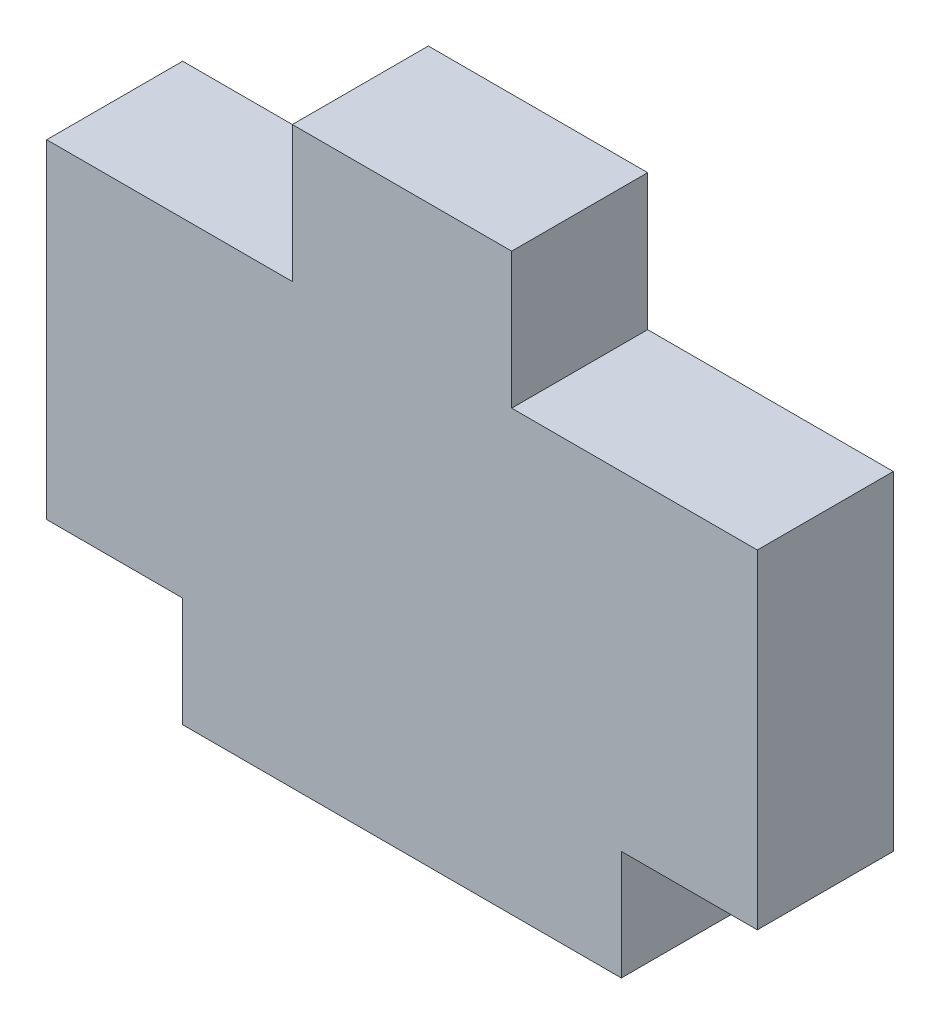
ISO-10303-21;
HEADER;
FILE_DESCRIPTION(('STEP AP214'),'2;1');
FILE_NAME('part.step','',(''),(''),'','','');
FILE_SCHEMA(('AUTOMOTIVE_DESIGN { 1 0 10303 214 1 1 1 1 }'));
ENDSEC;
DATA;
#1=APPLICATION_CONTEXT('core data for automotive mechanical design processes');
#2=APPLICATION_PROTOCOL_DEFINITION('international standard','automotive_design',2000,#1);
#3=PRODUCT_CONTEXT('',#1,'mechanical');
#4=PRODUCT('Part','Part','',(#3));
#5=PRODUCT_RELATED_PRODUCT_CATEGORY('part','',(#4));
#6=PRODUCT_DEFINITION_FORMATION('','',#4);
#7=PRODUCT_DEFINITION_CONTEXT('part definition',#1,'design');
#8=PRODUCT_DEFINITION('design','',#6,#7);
#9=PRODUCT_DEFINITION_SHAPE('','',#8);
#10=(LENGTH_UNIT() NAMED_UNIT(*) SI_UNIT(.MILLI.,.METRE.));
#11=(NAMED_UNIT(*) PLANE_ANGLE_UNIT() SI_UNIT($,.RADIAN.));
#12=(NAMED_UNIT(*) SI_UNIT($,.STERADIAN.) SOLID_ANGLE_UNIT());
#13=UNCERTAINTY_MEASURE_WITH_UNIT(LENGTH_MEASURE(1.E-05),#10,'distance_accuracy_value','');
#14=(GEOMETRIC_REPRESENTATION_CONTEXT(3) GLOBAL_UNCERTAINTY_ASSIGNED_CONTEXT((#13)) GLOBAL_UNIT_ASSIGNED_CONTEXT((#10,
#11,#12)) REPRESENTATION_CONTEXT('',''));
#15=CARTESIAN_POINT('',(0.,0.,0.));
#16=DIRECTION('',(0.,0.,1.));
#17=DIRECTION('',(1.,0.,0.));
#18=AXIS2_PLACEMENT_3D('',#15,#16,#17);
#19=CARTESIAN_POINT('',(32.4,10.,12.4));
#20=DIRECTION('',(-1.,0.,0.));
#21=DIRECTION('',(0.,0.,1.));
#22=AXIS2_PLACEMENT_3D('',#19,#20,#21);
#23=PLANE('',#22);
#24=DIRECTION('',(0.,1.,0.));
#25=VECTOR('',#24,1.);
#26=CARTESIAN_POINT('',(32.4,10.,0.));
#27=LINE('',#26,#25);
#28=CARTESIAN_POINT('',(32.4,10.,0.));
#29=VERTEX_POINT('',#28);
#30=CARTESIAN_POINT('',(32.4,40.,0.));
#31=VERTEX_POINT('',#30);
#32=EDGE_CURVE('E153',#29,#31,#27,.T.);
#33=ORIENTED_EDGE('',*,*,#32,.T.);
#34=DIRECTION('',(0.,0.,-1.));
#35=VECTOR('',#34,1.);
#36=CARTESIAN_POINT('',(32.4,40.,12.4));
#37=LINE('',#36,#35);
#38=CARTESIAN_POINT('',(32.4,40.,12.4));
#39=VERTEX_POINT('',#38);
#40=EDGE_CURVE('E11',#39,#31,#37,.T.);
#41=ORIENTED_EDGE('',*,*,#40,.F.);
#42=DIRECTION('',(0.,1.,0.));
#43=VECTOR('',#42,1.);
#44=CARTESIAN_POINT('',(32.4,10.,12.4));
#45=LINE('',#44,#43);
#46=CARTESIAN_POINT('',(32.4,10.,12.4));
#47=VERTEX_POINT('',#46);
#48=EDGE_CURVE('E175',#47,#39,#45,.T.);
#49=ORIENTED_EDGE('',*,*,#48,.F.);
#50=DIRECTION('',(0.,0.,-1.));
#51=VECTOR('',#50,1.);
#52=CARTESIAN_POINT('',(32.4,10.,12.4));
#53=LINE('',#52,#51);
#54=EDGE_CURVE('E149',#47,#29,#53,.T.);
#55=ORIENTED_EDGE('',*,*,#54,.T.);
#56=EDGE_LOOP('',(#33,#41,#49,#55));
#57=FACE_BOUND('',#56,.T.);
#58=ADVANCED_FACE('F33',(#57),#23,.F.);
#59=CARTESIAN_POINT('',(10.,40.,12.4));
#60=DIRECTION('',(0.,-1.,0.));
#61=DIRECTION('',(0.,0.,-1.));
#62=AXIS2_PLACEMENT_3D('',#59,#60,#61);
#63=PLANE('',#62);
#64=DIRECTION('',(-1.,0.,0.));
#65=VECTOR('',#64,1.);
#66=CARTESIAN_POINT('',(10.,40.,0.));
#67=LINE('',#66,#65);
#68=CARTESIAN_POINT('',(10.,40.,0.));
#69=VERTEX_POINT('',#68);
#70=EDGE_CURVE('E156',#31,#69,#67,.T.);
#71=ORIENTED_EDGE('',*,*,#70,.T.);
#72=DIRECTION('',(0.,0.,-1.));
#73=VECTOR('',#72,1.);
#74=CARTESIAN_POINT('',(10.,40.,12.4));
#75=LINE('',#74,#73);
#76=CARTESIAN_POINT('',(10.,40.,12.4));
#77=VERTEX_POINT('',#76);
#78=EDGE_CURVE('E41',#77,#69,#75,.T.);
#79=ORIENTED_EDGE('',*,*,#78,.F.);
#80=DIRECTION('',(-1.,0.,0.));
#81=VECTOR('',#80,1.);
#82=CARTESIAN_POINT('',(10.,40.,12.4));
#83=LINE('',#82,#81);
#84=EDGE_CURVE('E104',#39,#77,#83,.T.);
#85=ORIENTED_EDGE('',*,*,#84,.F.);
#86=ORIENTED_EDGE('',*,*,#40,.T.);
#87=EDGE_LOOP('',(#71,#79,#85,#86));
#88=FACE_BOUND('',#87,.T.);
#89=ADVANCED_FACE('F253',(#88),#63,.F.);
#90=CARTESIAN_POINT('',(10.,40.,12.4));
#91=DIRECTION('',(-1.,0.,0.));
#92=DIRECTION('',(0.,0.,1.));
#93=AXIS2_PLACEMENT_3D('',#90,#91,#92);
#94=PLANE('',#93);
#95=DIRECTION('',(0.,1.,0.));
#96=VECTOR('',#95,1.);
#97=CARTESIAN_POINT('',(10.,40.,0.));
#98=LINE('',#97,#96);
#99=CARTESIAN_POINT('',(10.,52.4,0.));
#100=VERTEX_POINT('',#99);
#101=EDGE_CURVE('E158',#69,#100,#98,.T.);
#102=ORIENTED_EDGE('',*,*,#101,.T.);
#103=DIRECTION('',(0.,0.,-1.));
#104=VECTOR('',#103,1.);
#105=CARTESIAN_POINT('',(10.,52.4,12.4));
#106=LINE('',#105,#104);
#107=CARTESIAN_POINT('',(10.,52.4,12.4));
#108=VERTEX_POINT('',#107);
#109=EDGE_CURVE('E194',#108,#100,#106,.T.);
#110=ORIENTED_EDGE('',*,*,#109,.F.);
#111=DIRECTION('',(0.,1.,0.));
#112=VECTOR('',#111,1.);
#113=CARTESIAN_POINT('',(10.,40.,12.4));
#114=LINE('',#113,#112);
#115=EDGE_CURVE('E202',#77,#108,#114,.T.);
#116=ORIENTED_EDGE('',*,*,#115,.F.);
#117=ORIENTED_EDGE('',*,*,#78,.T.);
#118=EDGE_LOOP('',(#102,#110,#116,#117));
#119=FACE_BOUND('',#118,.T.);
#120=ADVANCED_FACE('F200',(#119),#94,.F.);
#121=CARTESIAN_POINT('',(-10.,52.4,12.4));
#122=DIRECTION('',(0.,-1.,0.));
#123=DIRECTION('',(0.,0.,-1.));
#124=AXIS2_PLACEMENT_3D('',#121,#122,#123);
#125=PLANE('',#124);
#126=DIRECTION('',(-1.,0.,0.));
#127=VECTOR('',#126,1.);
#128=CARTESIAN_POINT('',(-10.,52.4,0.));
#129=LINE('',#128,#127);
#130=CARTESIAN_POINT('',(-10.,52.4,0.));
#131=VERTEX_POINT('',#130);
#132=EDGE_CURVE('E160',#100,#131,#129,.T.);
#133=ORIENTED_EDGE('',*,*,#132,.T.);
#134=DIRECTION('',(0.,0.,-1.));
#135=VECTOR('',#134,1.);
#136=CARTESIAN_POINT('',(-10.,52.4,12.4));
#137=LINE('',#136,#135);
#138=CARTESIAN_POINT('',(-10.,52.4,12.4));
#139=VERTEX_POINT('',#138);
#140=EDGE_CURVE('E191',#139,#131,#137,.T.);
#141=ORIENTED_EDGE('',*,*,#140,.F.);
#142=DIRECTION('',(-1.,0.,0.));
#143=VECTOR('',#142,1.);
#144=CARTESIAN_POINT('',(-10.,52.4,12.4));
#145=LINE('',#144,#143);
#146=EDGE_CURVE('E220',#108,#139,#145,.T.);
#147=ORIENTED_EDGE('',*,*,#146,.F.);
#148=ORIENTED_EDGE('',*,*,#109,.T.);
#149=EDGE_LOOP('',(#133,#141,#147,#148));
#150=FACE_BOUND('',#149,.T.);
#151=ADVANCED_FACE('F211',(#150),#125,.F.);
#152=CARTESIAN_POINT('',(-10.,40.,12.4));
#153=DIRECTION('',(1.,0.,0.));
#154=DIRECTION('',(0.,0.,-1.));
#155=AXIS2_PLACEMENT_3D('',#152,#153,#154);
#156=PLANE('',#155);
#157=DIRECTION('',(0.,-1.,0.));
#158=VECTOR('',#157,1.);
#159=CARTESIAN_POINT('',(-10.,40.,0.));
#160=LINE('',#159,#158);
#161=CARTESIAN_POINT('',(-10.,40.,0.));
#162=VERTEX_POINT('',#161);
#163=EDGE_CURVE('E162',#131,#162,#160,.T.);
#164=ORIENTED_EDGE('',*,*,#163,.T.);
#165=DIRECTION('',(0.,0.,-1.));
#166=VECTOR('',#165,1.);
#167=CARTESIAN_POINT('',(-10.,40.,12.4));
#168=LINE('',#167,#166);
#169=CARTESIAN_POINT('',(-10.,40.,12.4));
#170=VERTEX_POINT('',#169);
#171=EDGE_CURVE('E188',#170,#162,#168,.T.);
#172=ORIENTED_EDGE('',*,*,#171,.F.);
#173=DIRECTION('',(0.,-1.,0.));
#174=VECTOR('',#173,1.);
#175=CARTESIAN_POINT('',(-10.,40.,12.4));
#176=LINE('',#175,#174);
#177=EDGE_CURVE('E217',#139,#170,#176,.T.);
#178=ORIENTED_EDGE('',*,*,#177,.F.);
#179=ORIENTED_EDGE('',*,*,#140,.T.);
#180=EDGE_LOOP('',(#164,#172,#178,#179));
#181=FACE_BOUND('',#180,.T.);
#182=ADVANCED_FACE('F215',(#181),#156,.F.);
#183=CARTESIAN_POINT('',(-32.4,40.,12.4));
#184=DIRECTION('',(0.,-1.,0.));
#185=DIRECTION('',(0.,0.,-1.));
#186=AXIS2_PLACEMENT_3D('',#183,#184,#185);
#187=PLANE('',#186);
#188=DIRECTION('',(-1.,0.,0.));
#189=VECTOR('',#188,1.);
#190=CARTESIAN_POINT('',(-32.4,40.,0.));
#191=LINE('',#190,#189);
#192=CARTESIAN_POINT('',(-32.4,40.,0.));
#193=VERTEX_POINT('',#192);
#194=EDGE_CURVE('E164',#162,#193,#191,.T.);
#195=ORIENTED_EDGE('',*,*,#194,.T.);
#196=DIRECTION('',(0.,0.,-1.));
#197=VECTOR('',#196,1.);
#198=CARTESIAN_POINT('',(-32.4,40.,12.4));
#199=LINE('',#198,#197);
#200=CARTESIAN_POINT('',(-32.4,40.,12.4));
#201=VERTEX_POINT('',#200);
#202=EDGE_CURVE('E185',#201,#193,#199,.T.);
#203=ORIENTED_EDGE('',*,*,#202,.F.);
#204=DIRECTION('',(-1.,0.,0.));
#205=VECTOR('',#204,1.);
#206=CARTESIAN_POINT('',(-32.4,40.,12.4));
#207=LINE('',#206,#205);
#208=EDGE_CURVE('E219',#170,#201,#207,.T.);
#209=ORIENTED_EDGE('',*,*,#208,.F.);
#210=ORIENTED_EDGE('',*,*,#171,.T.);
#211=EDGE_LOOP('',(#195,#203,#209,#210));
#212=FACE_BOUND('',#211,.T.);
#213=ADVANCED_FACE('F266',(#212),#187,.F.);
#214=CARTESIAN_POINT('',(-32.4,10.,12.4));
#215=DIRECTION('',(1.,0.,0.));
#216=DIRECTION('',(0.,0.,-1.));
#217=AXIS2_PLACEMENT_3D('',#214,#215,#216);
#218=PLANE('',#217);
#219=DIRECTION('',(0.,-1.,0.));
#220=VECTOR('',#219,1.);
#221=CARTESIAN_POINT('',(-32.4,10.,0.));
#222=LINE('',#221,#220);
#223=CARTESIAN_POINT('',(-32.4,10.,0.));
#224=VERTEX_POINT('',#223);
#225=EDGE_CURVE('E166',#193,#224,#222,.T.);
#226=ORIENTED_EDGE('',*,*,#225,.T.);
#227=DIRECTION('',(0.,0.,-1.));
#228=VECTOR('',#227,1.);
#229=CARTESIAN_POINT('',(-32.4,10.,12.4));
#230=LINE('',#229,#228);
#231=CARTESIAN_POINT('',(-32.4,10.,12.4));
#232=VERTEX_POINT('',#231);
#233=EDGE_CURVE('E182',#232,#224,#230,.T.);
#234=ORIENTED_EDGE('',*,*,#233,.F.);
#235=DIRECTION('',(0.,-1.,0.));
#236=VECTOR('',#235,1.);
#237=CARTESIAN_POINT('',(-32.4,10.,12.4));
#238=LINE('',#237,#236);
#239=EDGE_CURVE('E222',#201,#232,#238,.T.);
#240=ORIENTED_EDGE('',*,*,#239,.F.);
#241=ORIENTED_EDGE('',*,*,#202,.T.);
#242=EDGE_LOOP('',(#226,#234,#240,#241));
#243=FACE_BOUND('',#242,.T.);
#244=ADVANCED_FACE('F269',(#243),#218,.F.);
#245=CARTESIAN_POINT('',(-32.4,10.,12.4));
#246=DIRECTION('',(0.,1.,0.));
#247=DIRECTION('',(0.,0.,1.));
#248=AXIS2_PLACEMENT_3D('',#245,#246,#247);
#249=PLANE('',#248);
#250=DIRECTION('',(1.,0.,0.));
#251=VECTOR('',#250,1.);
#252=CARTESIAN_POINT('',(-32.4,10.,0.));
#253=LINE('',#252,#251);
#254=CARTESIAN_POINT('',(-20.,10.,0.));
#255=VERTEX_POINT('',#254);
#256=EDGE_CURVE('E168',#224,#255,#253,.T.);
#257=ORIENTED_EDGE('',*,*,#256,.T.);
#258=DIRECTION('',(0.,0.,-1.));
#259=VECTOR('',#258,1.);
#260=CARTESIAN_POINT('',(-20.,10.,12.4));
#261=LINE('',#260,#259);
#262=CARTESIAN_POINT('',(-20.,10.,12.4));
#263=VERTEX_POINT('',#262);
#264=EDGE_CURVE('E179',#263,#255,#261,.T.);
#265=ORIENTED_EDGE('',*,*,#264,.F.);
#266=DIRECTION('',(1.,0.,0.));
#267=VECTOR('',#266,1.);
#268=CARTESIAN_POINT('',(-32.4,10.,12.4));
#269=LINE('',#268,#267);
#270=EDGE_CURVE('E228',#232,#263,#269,.T.);
#271=ORIENTED_EDGE('',*,*,#270,.F.);
#272=ORIENTED_EDGE('',*,*,#233,.T.);
#273=EDGE_LOOP('',(#257,#265,#271,#272));
#274=FACE_BOUND('',#273,.T.);
#275=ADVANCED_FACE('F234',(#274),#249,.F.);
#276=CARTESIAN_POINT('',(-20.,10.,12.4));
#277=DIRECTION('',(1.,0.,0.));
#278=DIRECTION('',(0.,0.,-1.));
#279=AXIS2_PLACEMENT_3D('',#276,#277,#278);
#280=PLANE('',#279);
#281=DIRECTION('',(0.,-1.,0.));
#282=VECTOR('',#281,1.);
#283=CARTESIAN_POINT('',(-20.,10.,0.));
#284=LINE('',#283,#282);
#285=CARTESIAN_POINT('',(-20.,0.,0.));
#286=VERTEX_POINT('',#285);
#287=EDGE_CURVE('E170',#255,#286,#284,.T.);
#288=ORIENTED_EDGE('',*,*,#287,.T.);
#289=DIRECTION('',(0.,0.,-1.));
#290=VECTOR('',#289,1.);
#291=CARTESIAN_POINT('',(-20.,0.,12.4));
#292=LINE('',#291,#290);
#293=CARTESIAN_POINT('',(-20.,0.,12.4));
#294=VERTEX_POINT('',#293);
#295=EDGE_CURVE('E144',#294,#286,#292,.T.);
#296=ORIENTED_EDGE('',*,*,#295,.F.);
#297=DIRECTION('',(0.,-1.,0.));
#298=VECTOR('',#297,1.);
#299=CARTESIAN_POINT('',(-20.,10.,12.4));
#300=LINE('',#299,#298);
#301=EDGE_CURVE('E135',#263,#294,#300,.T.);
#302=ORIENTED_EDGE('',*,*,#301,.F.);
#303=ORIENTED_EDGE('',*,*,#264,.T.);
#304=EDGE_LOOP('',(#288,#296,#302,#303));
#305=FACE_BOUND('',#304,.T.);
#306=ADVANCED_FACE('F238',(#305),#280,.F.);
#307=CARTESIAN_POINT('',(-20.,0.,12.4));
#308=DIRECTION('',(0.,1.,0.));
#309=DIRECTION('',(0.,0.,1.));
#310=AXIS2_PLACEMENT_3D('',#307,#308,#309);
#311=PLANE('',#310);
#312=DIRECTION('',(1.,0.,0.));
#313=VECTOR('',#312,1.);
#314=CARTESIAN_POINT('',(-20.,0.,0.));
#315=LINE('',#314,#313);
#316=CARTESIAN_POINT('',(20.,0.,0.));
#317=VERTEX_POINT('',#316);
#318=EDGE_CURVE('E143',#286,#317,#315,.T.);
#319=ORIENTED_EDGE('',*,*,#318,.T.);
#320=DIRECTION('',(0.,0.,-1.));
#321=VECTOR('',#320,1.);
#322=CARTESIAN_POINT('',(20.,0.,12.4));
#323=LINE('',#322,#321);
#324=CARTESIAN_POINT('',(20.,0.,12.4));
#325=VERTEX_POINT('',#324);
#326=EDGE_CURVE('E140',#325,#317,#323,.T.);
#327=ORIENTED_EDGE('',*,*,#326,.F.);
#328=DIRECTION('',(1.,0.,0.));
#329=VECTOR('',#328,1.);
#330=CARTESIAN_POINT('',(-20.,0.,12.4));
#331=LINE('',#330,#329);
#332=EDGE_CURVE('E129',#294,#325,#331,.T.);
#333=ORIENTED_EDGE('',*,*,#332,.F.);
#334=ORIENTED_EDGE('',*,*,#295,.T.);
#335=EDGE_LOOP('',(#319,#327,#333,#334));
#336=FACE_BOUND('',#335,.T.);
#337=ADVANCED_FACE('F141',(#336),#311,.F.);
#338=CARTESIAN_POINT('',(20.,10.,12.4));
#339=DIRECTION('',(-1.,0.,0.));
#340=DIRECTION('',(0.,0.,1.));
#341=AXIS2_PLACEMENT_3D('',#338,#339,#340);
#342=PLANE('',#341);
#343=DIRECTION('',(0.,1.,0.));
#344=VECTOR('',#343,1.);
#345=CARTESIAN_POINT('',(20.,10.,0.));
#346=LINE('',#345,#344);
#347=CARTESIAN_POINT('',(20.,10.,0.));
#348=VERTEX_POINT('',#347);
#349=EDGE_CURVE('E90',#317,#348,#346,.T.);
#350=ORIENTED_EDGE('',*,*,#349,.T.);
#351=DIRECTION('',(0.,0.,-1.));
#352=VECTOR('',#351,1.);
#353=CARTESIAN_POINT('',(20.,10.,12.4));
#354=LINE('',#353,#352);
#355=CARTESIAN_POINT('',(20.,10.,12.4));
#356=VERTEX_POINT('',#355);
#357=EDGE_CURVE('E145',#356,#348,#354,.T.);
#358=ORIENTED_EDGE('',*,*,#357,.F.);
#359=DIRECTION('',(0.,1.,0.));
#360=VECTOR('',#359,1.);
#361=CARTESIAN_POINT('',(20.,10.,12.4));
#362=LINE('',#361,#360);
#363=EDGE_CURVE('E133',#325,#356,#362,.T.);
#364=ORIENTED_EDGE('',*,*,#363,.F.);
#365=ORIENTED_EDGE('',*,*,#326,.T.);
#366=EDGE_LOOP('',(#350,#358,#364,#365));
#367=FACE_BOUND('',#366,.T.);
#368=ADVANCED_FACE('F147',(#367),#342,.F.);
#369=CARTESIAN_POINT('',(32.4,10.,12.4));
#370=DIRECTION('',(0.,1.,0.));
#371=DIRECTION('',(0.,0.,1.));
#372=AXIS2_PLACEMENT_3D('',#369,#370,#371);
#373=PLANE('',#372);
#374=DIRECTION('',(1.,0.,0.));
#375=VECTOR('',#374,1.);
#376=CARTESIAN_POINT('',(32.4,10.,0.));
#377=LINE('',#376,#375);
#378=EDGE_CURVE('E96',#348,#29,#377,.T.);
#379=ORIENTED_EDGE('',*,*,#378,.T.);
#380=ORIENTED_EDGE('',*,*,#54,.F.);
#381=DIRECTION('',(1.,0.,0.));
#382=VECTOR('',#381,1.);
#383=CARTESIAN_POINT('',(32.4,10.,12.4));
#384=LINE('',#383,#382);
#385=EDGE_CURVE('E49',#356,#47,#384,.T.);
#386=ORIENTED_EDGE('',*,*,#385,.F.);
#387=ORIENTED_EDGE('',*,*,#357,.T.);
#388=EDGE_LOOP('',(#379,#380,#386,#387));
#389=FACE_BOUND('',#388,.T.);
#390=ADVANCED_FACE('F242',(#389),#373,.F.);
#391=CARTESIAN_POINT('',(0.,0.,12.4));
#392=DIRECTION('',(0.,0.,-1.));
#393=DIRECTION('',(-1.,0.,0.));
#394=AXIS2_PLACEMENT_3D('',#391,#392,#393);
#395=PLANE('',#394);
#396=ORIENTED_EDGE('',*,*,#48,.T.);
#397=ORIENTED_EDGE('',*,*,#84,.T.);
#398=ORIENTED_EDGE('',*,*,#115,.T.);
#399=ORIENTED_EDGE('',*,*,#146,.T.);
#400=ORIENTED_EDGE('',*,*,#177,.T.);
#401=ORIENTED_EDGE('',*,*,#208,.T.);
#402=ORIENTED_EDGE('',*,*,#239,.T.);
#403=ORIENTED_EDGE('',*,*,#270,.T.);
#404=ORIENTED_EDGE('',*,*,#301,.T.);
#405=ORIENTED_EDGE('',*,*,#332,.T.);
#406=ORIENTED_EDGE('',*,*,#363,.T.);
#407=ORIENTED_EDGE('',*,*,#385,.T.);
#408=EDGE_LOOP('',(#396,#397,#398,#399,#400,#401,#402,#403,#404,#405,#406,#407));
#409=FACE_BOUND('',#408,.T.);
#410=ADVANCED_FACE('F131',(#409),#395,.F.);
#411=CARTESIAN_POINT('',(0.,0.,0.));
#412=DIRECTION('',(0.,0.,-1.));
#413=DIRECTION('',(-1.,0.,0.));
#414=AXIS2_PLACEMENT_3D('',#411,#412,#413);
#415=PLANE('',#414);
#416=ORIENTED_EDGE('',*,*,#32,.F.);
#417=ORIENTED_EDGE('',*,*,#378,.F.);
#418=ORIENTED_EDGE('',*,*,#349,.F.);
#419=ORIENTED_EDGE('',*,*,#318,.F.);
#420=ORIENTED_EDGE('',*,*,#287,.F.);
#421=ORIENTED_EDGE('',*,*,#256,.F.);
#422=ORIENTED_EDGE('',*,*,#225,.F.);
#423=ORIENTED_EDGE('',*,*,#194,.F.);
#424=ORIENTED_EDGE('',*,*,#163,.F.);
#425=ORIENTED_EDGE('',*,*,#132,.F.);
#426=ORIENTED_EDGE('',*,*,#101,.F.);
#427=ORIENTED_EDGE('',*,*,#70,.F.);
#428=EDGE_LOOP('',(#416,#417,#418,#419,#420,#421,#422,#423,#424,#425,#426,#427));
#429=FACE_BOUND('',#428,.T.);
#430=ADVANCED_FACE('F206',(#429),#415,.T.);
#431=CLOSED_SHELL('',(#58,#89,#120,#151,#182,#213,#244,#275,#306,#337,#368,#390,#410,#430));
#432=MANIFOLD_SOLID_BREP('B2',#431);
#433=ADVANCED_BREP_SHAPE_REPRESENTATION('',(#18,#432),#14);
#434=SHAPE_DEFINITION_REPRESENTATION(#9,#433);
ENDSEC;
END-ISO-10303-21;
